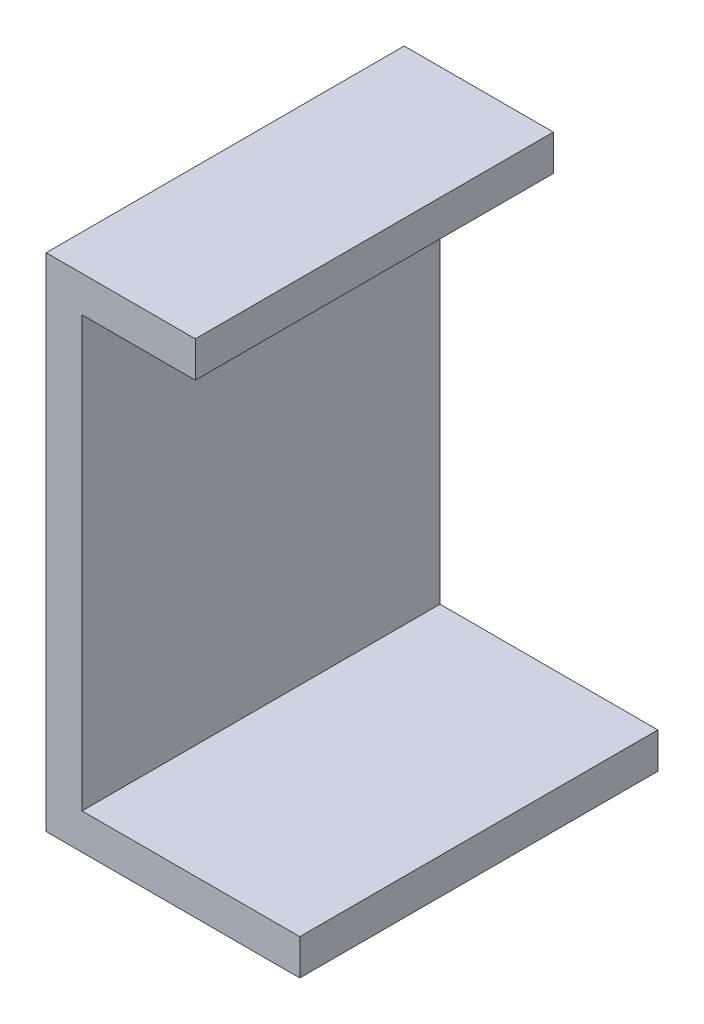
ISO-10303-21;
HEADER;
FILE_DESCRIPTION(('STEP AP214'),'2;1');
FILE_NAME('part.step','',(''),(''),'','','');
FILE_SCHEMA(('AUTOMOTIVE_DESIGN { 1 0 10303 214 1 1 1 1 }'));
ENDSEC;
DATA;
#1=APPLICATION_CONTEXT('core data for automotive mechanical design processes');
#2=APPLICATION_PROTOCOL_DEFINITION('international standard','automotive_design',2000,#1);
#3=PRODUCT_CONTEXT('',#1,'mechanical');
#4=PRODUCT('Part','Part','',(#3));
#5=PRODUCT_RELATED_PRODUCT_CATEGORY('part','',(#4));
#6=PRODUCT_DEFINITION_FORMATION('','',#4);
#7=PRODUCT_DEFINITION_CONTEXT('part definition',#1,'design');
#8=PRODUCT_DEFINITION('design','',#6,#7);
#9=PRODUCT_DEFINITION_SHAPE('','',#8);
#10=(LENGTH_UNIT() NAMED_UNIT(*) SI_UNIT(.MILLI.,.METRE.));
#11=(NAMED_UNIT(*) PLANE_ANGLE_UNIT() SI_UNIT($,.RADIAN.));
#12=(NAMED_UNIT(*) SI_UNIT($,.STERADIAN.) SOLID_ANGLE_UNIT());
#13=UNCERTAINTY_MEASURE_WITH_UNIT(LENGTH_MEASURE(1.E-05),#10,'distance_accuracy_value','');
#14=(GEOMETRIC_REPRESENTATION_CONTEXT(3) GLOBAL_UNCERTAINTY_ASSIGNED_CONTEXT((#13)) GLOBAL_UNIT_ASSIGNED_CONTEXT((#10,
#11,#12)) REPRESENTATION_CONTEXT('',''));
#15=CARTESIAN_POINT('',(0.,0.,0.));
#16=DIRECTION('',(0.,0.,1.));
#17=DIRECTION('',(1.,0.,0.));
#18=AXIS2_PLACEMENT_3D('',#15,#16,#17);
#19=CARTESIAN_POINT('',(0.,0.,15.));
#20=DIRECTION('',(0.,-1.,0.));
#21=DIRECTION('',(1.,0.,0.));
#22=AXIS2_PLACEMENT_3D('',#19,#20,#21);
#23=PLANE('',#22);
#24=DIRECTION('',(-1.,0.,0.));
#25=VECTOR('',#24,1.);
#26=CARTESIAN_POINT('',(0.,0.,-15.));
#27=LINE('',#26,#25);
#28=CARTESIAN_POINT('',(21.2507953288821,0.,-15.));
#29=VERTEX_POINT('',#28);
#30=CARTESIAN_POINT('',(0.,0.,-15.));
#31=VERTEX_POINT('',#30);
#32=EDGE_CURVE('E127',#29,#31,#27,.T.);
#33=ORIENTED_EDGE('',*,*,#32,.F.);
#34=DIRECTION('',(0.,0.,-1.));
#35=VECTOR('',#34,1.);
#36=CARTESIAN_POINT('',(21.2507953288821,0.,15.));
#37=LINE('',#36,#35);
#38=CARTESIAN_POINT('',(21.2507953288821,0.,15.));
#39=VERTEX_POINT('',#38);
#40=EDGE_CURVE('E11',#39,#29,#37,.T.);
#41=ORIENTED_EDGE('',*,*,#40,.F.);
#42=DIRECTION('',(-1.,0.,0.));
#43=VECTOR('',#42,1.);
#44=CARTESIAN_POINT('',(0.,0.,15.));
#45=LINE('',#44,#43);
#46=CARTESIAN_POINT('',(0.,0.,15.));
#47=VERTEX_POINT('',#46);
#48=EDGE_CURVE('E146',#39,#47,#45,.T.);
#49=ORIENTED_EDGE('',*,*,#48,.T.);
#50=DIRECTION('',(0.,0.,-1.));
#51=VECTOR('',#50,1.);
#52=CARTESIAN_POINT('',(0.,0.,15.));
#53=LINE('',#52,#51);
#54=EDGE_CURVE('E49',#47,#31,#53,.T.);
#55=ORIENTED_EDGE('',*,*,#54,.T.);
#56=EDGE_LOOP('',(#33,#41,#49,#55));
#57=FACE_BOUND('',#56,.T.);
#58=ADVANCED_FACE('F33',(#57),#23,.T.);
#59=CARTESIAN_POINT('',(21.2507953288821,0.,15.));
#60=DIRECTION('',(-1.,0.,0.));
#61=DIRECTION('',(0.,0.,1.));
#62=AXIS2_PLACEMENT_3D('',#59,#60,#61);
#63=PLANE('',#62);
#64=DIRECTION('',(0.,1.,0.));
#65=VECTOR('',#64,1.);
#66=CARTESIAN_POINT('',(21.2507953288821,0.,-15.));
#67=LINE('',#66,#65);
#68=CARTESIAN_POINT('',(21.2507953288821,3.,-15.));
#69=VERTEX_POINT('',#68);
#70=EDGE_CURVE('E129',#29,#69,#67,.T.);
#71=ORIENTED_EDGE('',*,*,#70,.T.);
#72=DIRECTION('',(0.,0.,-1.));
#73=VECTOR('',#72,1.);
#74=CARTESIAN_POINT('',(21.2507953288821,3.,15.));
#75=LINE('',#74,#73);
#76=CARTESIAN_POINT('',(21.2507953288821,3.,15.));
#77=VERTEX_POINT('',#76);
#78=EDGE_CURVE('E41',#77,#69,#75,.T.);
#79=ORIENTED_EDGE('',*,*,#78,.F.);
#80=DIRECTION('',(0.,1.,0.));
#81=VECTOR('',#80,1.);
#82=CARTESIAN_POINT('',(21.2507953288821,0.,15.));
#83=LINE('',#82,#81);
#84=EDGE_CURVE('E172',#39,#77,#83,.T.);
#85=ORIENTED_EDGE('',*,*,#84,.F.);
#86=ORIENTED_EDGE('',*,*,#40,.T.);
#87=EDGE_LOOP('',(#71,#79,#85,#86));
#88=FACE_BOUND('',#87,.T.);
#89=ADVANCED_FACE('F187',(#88),#63,.F.);
#90=CARTESIAN_POINT('',(0.,3.,15.));
#91=DIRECTION('',(0.,-1.,0.));
#92=DIRECTION('',(1.,0.,0.));
#93=AXIS2_PLACEMENT_3D('',#90,#91,#92);
#94=PLANE('',#93);
#95=DIRECTION('',(-1.,0.,0.));
#96=VECTOR('',#95,1.);
#97=CARTESIAN_POINT('',(0.,3.,-15.));
#98=LINE('',#97,#96);
#99=CARTESIAN_POINT('',(3.,3.,-15.));
#100=VERTEX_POINT('',#99);
#101=EDGE_CURVE('E131',#69,#100,#98,.T.);
#102=ORIENTED_EDGE('',*,*,#101,.T.);
#103=DIRECTION('',(0.,0.,-1.));
#104=VECTOR('',#103,1.);
#105=CARTESIAN_POINT('',(3.,3.,15.));
#106=LINE('',#105,#104);
#107=CARTESIAN_POINT('',(3.,3.,15.));
#108=VERTEX_POINT('',#107);
#109=EDGE_CURVE('E152',#108,#100,#106,.T.);
#110=ORIENTED_EDGE('',*,*,#109,.F.);
#111=DIRECTION('',(-1.,0.,0.));
#112=VECTOR('',#111,1.);
#113=CARTESIAN_POINT('',(0.,3.,15.));
#114=LINE('',#113,#112);
#115=EDGE_CURVE('E160',#77,#108,#114,.T.);
#116=ORIENTED_EDGE('',*,*,#115,.F.);
#117=ORIENTED_EDGE('',*,*,#78,.T.);
#118=EDGE_LOOP('',(#102,#110,#116,#117));
#119=FACE_BOUND('',#118,.T.);
#120=ADVANCED_FACE('F158',(#119),#94,.F.);
#121=CARTESIAN_POINT('',(3.,0.,15.));
#122=DIRECTION('',(1.,0.,0.));
#123=DIRECTION('',(0.,1.,0.));
#124=AXIS2_PLACEMENT_3D('',#121,#122,#123);
#125=PLANE('',#124);
#126=DIRECTION('',(0.,-1.,0.));
#127=VECTOR('',#126,1.);
#128=CARTESIAN_POINT('',(3.,0.,-15.));
#129=LINE('',#128,#127);
#130=CARTESIAN_POINT('',(3.,39.,-15.));
#131=VERTEX_POINT('',#130);
#132=EDGE_CURVE('E134',#131,#100,#129,.T.);
#133=ORIENTED_EDGE('',*,*,#132,.F.);
#134=DIRECTION('',(0.,0.,-1.));
#135=VECTOR('',#134,1.);
#136=CARTESIAN_POINT('',(3.,39.,15.));
#137=LINE('',#136,#135);
#138=CARTESIAN_POINT('',(3.,39.,15.));
#139=VERTEX_POINT('',#138);
#140=EDGE_CURVE('E150',#139,#131,#137,.T.);
#141=ORIENTED_EDGE('',*,*,#140,.F.);
#142=DIRECTION('',(0.,-1.,0.));
#143=VECTOR('',#142,1.);
#144=CARTESIAN_POINT('',(3.,0.,15.));
#145=LINE('',#144,#143);
#146=EDGE_CURVE('E170',#139,#108,#145,.T.);
#147=ORIENTED_EDGE('',*,*,#146,.T.);
#148=ORIENTED_EDGE('',*,*,#109,.T.);
#149=EDGE_LOOP('',(#133,#141,#147,#148));
#150=FACE_BOUND('',#149,.T.);
#151=ADVANCED_FACE('F168',(#150),#125,.T.);
#152=CARTESIAN_POINT('',(0.,39.,15.));
#153=DIRECTION('',(0.,-1.,0.));
#154=DIRECTION('',(1.,0.,0.));
#155=AXIS2_PLACEMENT_3D('',#152,#153,#154);
#156=PLANE('',#155);
#157=DIRECTION('',(-1.,0.,0.));
#158=VECTOR('',#157,1.);
#159=CARTESIAN_POINT('',(0.,39.,-15.));
#160=LINE('',#159,#158);
#161=CARTESIAN_POINT('',(12.4964028776978,39.,-15.));
#162=VERTEX_POINT('',#161);
#163=EDGE_CURVE('E137',#162,#131,#160,.T.);
#164=ORIENTED_EDGE('',*,*,#163,.F.);
#165=DIRECTION('',(0.,0.,-1.));
#166=VECTOR('',#165,1.);
#167=CARTESIAN_POINT('',(12.4964028776978,39.,15.));
#168=LINE('',#167,#166);
#169=CARTESIAN_POINT('',(12.4964028776978,39.,15.));
#170=VERTEX_POINT('',#169);
#171=EDGE_CURVE('E108',#170,#162,#168,.T.);
#172=ORIENTED_EDGE('',*,*,#171,.F.);
#173=DIRECTION('',(-1.,0.,0.));
#174=VECTOR('',#173,1.);
#175=CARTESIAN_POINT('',(0.,39.,15.));
#176=LINE('',#175,#174);
#177=EDGE_CURVE('E119',#170,#139,#176,.T.);
#178=ORIENTED_EDGE('',*,*,#177,.T.);
#179=ORIENTED_EDGE('',*,*,#140,.T.);
#180=EDGE_LOOP('',(#164,#172,#178,#179));
#181=FACE_BOUND('',#180,.T.);
#182=ADVANCED_FACE('F198',(#181),#156,.T.);
#183=CARTESIAN_POINT('',(12.4964028776978,0.,15.));
#184=DIRECTION('',(1.,0.,0.));
#185=DIRECTION('',(0.,0.,-1.));
#186=AXIS2_PLACEMENT_3D('',#183,#184,#185);
#187=PLANE('',#186);
#188=DIRECTION('',(0.,-1.,0.));
#189=VECTOR('',#188,1.);
#190=CARTESIAN_POINT('',(12.4964028776978,0.,-15.));
#191=LINE('',#190,#189);
#192=CARTESIAN_POINT('',(12.4964028776978,42.,-15.));
#193=VERTEX_POINT('',#192);
#194=EDGE_CURVE('E104',#193,#162,#191,.T.);
#195=ORIENTED_EDGE('',*,*,#194,.F.);
#196=DIRECTION('',(0.,0.,-1.));
#197=VECTOR('',#196,1.);
#198=CARTESIAN_POINT('',(12.4964028776978,42.,15.));
#199=LINE('',#198,#197);
#200=CARTESIAN_POINT('',(12.4964028776978,42.,15.));
#201=VERTEX_POINT('',#200);
#202=EDGE_CURVE('E99',#201,#193,#199,.T.);
#203=ORIENTED_EDGE('',*,*,#202,.F.);
#204=DIRECTION('',(0.,-1.,0.));
#205=VECTOR('',#204,1.);
#206=CARTESIAN_POINT('',(12.4964028776978,0.,15.));
#207=LINE('',#206,#205);
#208=EDGE_CURVE('E102',#201,#170,#207,.T.);
#209=ORIENTED_EDGE('',*,*,#208,.T.);
#210=ORIENTED_EDGE('',*,*,#171,.T.);
#211=EDGE_LOOP('',(#195,#203,#209,#210));
#212=FACE_BOUND('',#211,.T.);
#213=ADVANCED_FACE('F101',(#212),#187,.T.);
#214=CARTESIAN_POINT('',(0.,42.,15.));
#215=DIRECTION('',(0.,1.,0.));
#216=DIRECTION('',(0.,0.,1.));
#217=AXIS2_PLACEMENT_3D('',#214,#215,#216);
#218=PLANE('',#217);
#219=DIRECTION('',(1.,0.,0.));
#220=VECTOR('',#219,1.);
#221=CARTESIAN_POINT('',(0.,42.,-15.));
#222=LINE('',#221,#220);
#223=CARTESIAN_POINT('',(0.,42.,-15.));
#224=VERTEX_POINT('',#223);
#225=EDGE_CURVE('E141',#224,#193,#222,.T.);
#226=ORIENTED_EDGE('',*,*,#225,.F.);
#227=DIRECTION('',(0.,0.,-1.));
#228=VECTOR('',#227,1.);
#229=CARTESIAN_POINT('',(0.,42.,15.));
#230=LINE('',#229,#228);
#231=CARTESIAN_POINT('',(0.,42.,15.));
#232=VERTEX_POINT('',#231);
#233=EDGE_CURVE('E74',#232,#224,#230,.T.);
#234=ORIENTED_EDGE('',*,*,#233,.F.);
#235=DIRECTION('',(1.,0.,0.));
#236=VECTOR('',#235,1.);
#237=CARTESIAN_POINT('',(0.,42.,15.));
#238=LINE('',#237,#236);
#239=EDGE_CURVE('E116',#232,#201,#238,.T.);
#240=ORIENTED_EDGE('',*,*,#239,.T.);
#241=ORIENTED_EDGE('',*,*,#202,.T.);
#242=EDGE_LOOP('',(#226,#234,#240,#241));
#243=FACE_BOUND('',#242,.T.);
#244=ADVANCED_FACE('F121',(#243),#218,.T.);
#245=CARTESIAN_POINT('',(0.,0.,15.));
#246=DIRECTION('',(-1.,0.,0.));
#247=DIRECTION('',(0.,0.,1.));
#248=AXIS2_PLACEMENT_3D('',#245,#246,#247);
#249=PLANE('',#248);
#250=DIRECTION('',(0.,1.,0.));
#251=VECTOR('',#250,1.);
#252=CARTESIAN_POINT('',(0.,0.,-15.));
#253=LINE('',#252,#251);
#254=EDGE_CURVE('E143',#31,#224,#253,.T.);
#255=ORIENTED_EDGE('',*,*,#254,.F.);
#256=ORIENTED_EDGE('',*,*,#54,.F.);
#257=DIRECTION('',(0.,1.,0.));
#258=VECTOR('',#257,1.);
#259=CARTESIAN_POINT('',(0.,0.,15.));
#260=LINE('',#259,#258);
#261=EDGE_CURVE('E122',#47,#232,#260,.T.);
#262=ORIENTED_EDGE('',*,*,#261,.T.);
#263=ORIENTED_EDGE('',*,*,#233,.T.);
#264=EDGE_LOOP('',(#255,#256,#262,#263));
#265=FACE_BOUND('',#264,.T.);
#266=ADVANCED_FACE('F176',(#265),#249,.T.);
#267=CARTESIAN_POINT('',(0.,0.,15.));
#268=DIRECTION('',(0.,0.,1.));
#269=DIRECTION('',(1.,0.,0.));
#270=AXIS2_PLACEMENT_3D('',#267,#268,#269);
#271=PLANE('',#270);
#272=ORIENTED_EDGE('',*,*,#48,.F.);
#273=ORIENTED_EDGE('',*,*,#84,.T.);
#274=ORIENTED_EDGE('',*,*,#115,.T.);
#275=ORIENTED_EDGE('',*,*,#146,.F.);
#276=ORIENTED_EDGE('',*,*,#177,.F.);
#277=ORIENTED_EDGE('',*,*,#208,.F.);
#278=ORIENTED_EDGE('',*,*,#239,.F.);
#279=ORIENTED_EDGE('',*,*,#261,.F.);
#280=EDGE_LOOP('',(#272,#273,#274,#275,#276,#277,#278,#279));
#281=FACE_BOUND('',#280,.T.);
#282=ADVANCED_FACE('F114',(#281),#271,.T.);
#283=CARTESIAN_POINT('',(0.,0.,-15.));
#284=DIRECTION('',(0.,0.,1.));
#285=DIRECTION('',(1.,0.,0.));
#286=AXIS2_PLACEMENT_3D('',#283,#284,#285);
#287=PLANE('',#286);
#288=ORIENTED_EDGE('',*,*,#32,.T.);
#289=ORIENTED_EDGE('',*,*,#254,.T.);
#290=ORIENTED_EDGE('',*,*,#225,.T.);
#291=ORIENTED_EDGE('',*,*,#194,.T.);
#292=ORIENTED_EDGE('',*,*,#163,.T.);
#293=ORIENTED_EDGE('',*,*,#132,.T.);
#294=ORIENTED_EDGE('',*,*,#101,.F.);
#295=ORIENTED_EDGE('',*,*,#70,.F.);
#296=EDGE_LOOP('',(#288,#289,#290,#291,#292,#293,#294,#295));
#297=FACE_BOUND('',#296,.T.);
#298=ADVANCED_FACE('F164',(#297),#287,.F.);
#299=CLOSED_SHELL('',(#58,#89,#120,#151,#182,#213,#244,#266,#282,#298));
#300=MANIFOLD_SOLID_BREP('B2',#299);
#301=ADVANCED_BREP_SHAPE_REPRESENTATION('',(#18,#300),#14);
#302=SHAPE_DEFINITION_REPRESENTATION(#9,#301);
ENDSEC;
END-ISO-10303-21;
